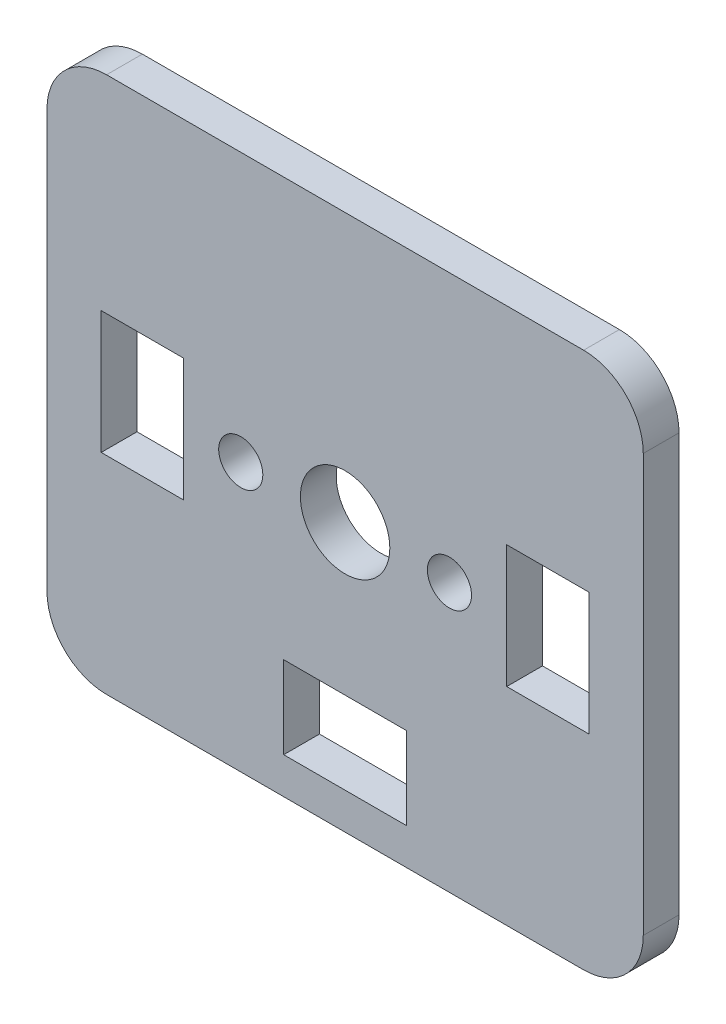
ISO-10303-21;
HEADER;
FILE_DESCRIPTION(('STEP AP214'),'2;1');
FILE_NAME('part.step','',(''),(''),'','','');
FILE_SCHEMA(('AUTOMOTIVE_DESIGN { 1 0 10303 214 1 1 1 1 }'));
ENDSEC;
DATA;
#1=APPLICATION_CONTEXT('core data for automotive mechanical design processes');
#2=APPLICATION_PROTOCOL_DEFINITION('international standard','automotive_design',2000,#1);
#3=PRODUCT_CONTEXT('',#1,'mechanical');
#4=PRODUCT('Part','Part','',(#3));
#5=PRODUCT_RELATED_PRODUCT_CATEGORY('part','',(#4));
#6=PRODUCT_DEFINITION_FORMATION('','',#4);
#7=PRODUCT_DEFINITION_CONTEXT('part definition',#1,'design');
#8=PRODUCT_DEFINITION('design','',#6,#7);
#9=PRODUCT_DEFINITION_SHAPE('','',#8);
#10=(LENGTH_UNIT() NAMED_UNIT(*) SI_UNIT(.MILLI.,.METRE.));
#11=(NAMED_UNIT(*) PLANE_ANGLE_UNIT() SI_UNIT($,.RADIAN.));
#12=(NAMED_UNIT(*) SI_UNIT($,.STERADIAN.) SOLID_ANGLE_UNIT());
#13=UNCERTAINTY_MEASURE_WITH_UNIT(LENGTH_MEASURE(1.E-05),#10,'distance_accuracy_value','');
#14=(GEOMETRIC_REPRESENTATION_CONTEXT(3) GLOBAL_UNCERTAINTY_ASSIGNED_CONTEXT((#13)) GLOBAL_UNIT_ASSIGNED_CONTEXT((#10,
#11,#12)) REPRESENTATION_CONTEXT('',''));
#15=CARTESIAN_POINT('',(0.,0.,0.));
#16=DIRECTION('',(0.,0.,1.));
#17=DIRECTION('',(1.,0.,0.));
#18=AXIS2_PLACEMENT_3D('',#15,#16,#17);
#19=CARTESIAN_POINT('',(0.,0.,-3.));
#20=DIRECTION('',(0.,0.,1.));
#21=DIRECTION('',(-1.,0.,0.));
#22=AXIS2_PLACEMENT_3D('',#19,#20,#21);
#23=PLANE('',#22);
#24=DIRECTION('',(0.,1.,0.));
#25=VECTOR('',#24,1.);
#26=CARTESIAN_POINT('',(20.45,5.15000000000001,-3.));
#27=LINE('',#26,#25);
#28=CARTESIAN_POINT('',(20.45,-5.14999999999999,-3.));
#29=VERTEX_POINT('',#28);
#30=CARTESIAN_POINT('',(20.45,5.15000000000001,-3.));
#31=VERTEX_POINT('',#30);
#32=EDGE_CURVE('E214',#29,#31,#27,.T.);
#33=ORIENTED_EDGE('',*,*,#32,.T.);
#34=DIRECTION('',(-1.,0.,0.));
#35=VECTOR('',#34,1.);
#36=CARTESIAN_POINT('',(20.45,5.15000000000001,-3.));
#37=LINE('',#36,#35);
#38=CARTESIAN_POINT('',(13.55,5.15,-3.));
#39=VERTEX_POINT('',#38);
#40=EDGE_CURVE('E217',#31,#39,#37,.T.);
#41=ORIENTED_EDGE('',*,*,#40,.T.);
#42=DIRECTION('',(0.,-1.,0.));
#43=VECTOR('',#42,1.);
#44=CARTESIAN_POINT('',(13.55,5.15,-3.));
#45=LINE('',#44,#43);
#46=CARTESIAN_POINT('',(13.55,-5.15,-3.));
#47=VERTEX_POINT('',#46);
#48=EDGE_CURVE('E221',#39,#47,#45,.T.);
#49=ORIENTED_EDGE('',*,*,#48,.T.);
#50=DIRECTION('',(1.,0.,0.));
#51=VECTOR('',#50,1.);
#52=CARTESIAN_POINT('',(20.45,-5.14999999999999,-3.));
#53=LINE('',#52,#51);
#54=EDGE_CURVE('E224',#47,#29,#53,.T.);
#55=ORIENTED_EDGE('',*,*,#54,.T.);
#56=EDGE_LOOP('',(#33,#41,#49,#55));
#57=FACE_BOUND('',#56,.T.);
#58=CARTESIAN_POINT('',(-8.75,0.,-3.));
#59=DIRECTION('',(0.,0.,1.));
#60=DIRECTION('',(1.,0.,0.));
#61=AXIS2_PLACEMENT_3D('',#58,#59,#60);
#62=CIRCLE('',#61,1.85);
#63=CARTESIAN_POINT('',(-6.9,0.,-3.));
#64=VERTEX_POINT('',#63);
#65=EDGE_CURVE('E278',#64,#64,#62,.T.);
#66=ORIENTED_EDGE('',*,*,#65,.T.);
#67=EDGE_LOOP('',(#66));
#68=FACE_BOUND('',#67,.T.);
#69=CARTESIAN_POINT('',(8.75,0.,-3.));
#70=DIRECTION('',(0.,0.,1.));
#71=DIRECTION('',(1.,0.,0.));
#72=AXIS2_PLACEMENT_3D('',#69,#70,#71);
#73=CIRCLE('',#72,1.85);
#74=CARTESIAN_POINT('',(10.6,0.,-3.));
#75=VERTEX_POINT('',#74);
#76=EDGE_CURVE('E284',#75,#75,#73,.T.);
#77=ORIENTED_EDGE('',*,*,#76,.T.);
#78=EDGE_LOOP('',(#77));
#79=FACE_BOUND('',#78,.T.);
#80=CARTESIAN_POINT('',(0.,0.,-3.));
#81=DIRECTION('',(0.,0.,1.));
#82=DIRECTION('',(1.,0.,0.));
#83=AXIS2_PLACEMENT_3D('',#80,#81,#82);
#84=CIRCLE('',#83,3.75);
#85=CARTESIAN_POINT('',(3.75000000000001,0.,-3.));
#86=VERTEX_POINT('',#85);
#87=EDGE_CURVE('E290',#86,#86,#84,.T.);
#88=ORIENTED_EDGE('',*,*,#87,.T.);
#89=EDGE_LOOP('',(#88));
#90=FACE_BOUND('',#89,.T.);
#91=DIRECTION('',(-1.,0.,0.));
#92=VECTOR('',#91,1.);
#93=CARTESIAN_POINT('',(-25.,22.5,-3.));
#94=LINE('',#93,#92);
#95=CARTESIAN_POINT('',(20.,22.5,-3.));
#96=VERTEX_POINT('',#95);
#97=CARTESIAN_POINT('',(-20.,22.5,-3.));
#98=VERTEX_POINT('',#97);
#99=EDGE_CURVE('E299',#96,#98,#94,.T.);
#100=ORIENTED_EDGE('',*,*,#99,.F.);
#101=CARTESIAN_POINT('',(20.,17.5,-3.));
#102=DIRECTION('',(0.,0.,-1.));
#103=DIRECTION('',(-1.,0.,0.));
#104=AXIS2_PLACEMENT_3D('',#101,#102,#103);
#105=CIRCLE('',#104,5.);
#106=CARTESIAN_POINT('',(25.,17.5,-3.));
#107=VERTEX_POINT('',#106);
#108=EDGE_CURVE('E337',#107,#96,#105,.F.);
#109=ORIENTED_EDGE('',*,*,#108,.F.);
#110=DIRECTION('',(0.,1.,0.));
#111=VECTOR('',#110,1.);
#112=CARTESIAN_POINT('',(25.,-22.5,-3.));
#113=LINE('',#112,#111);
#114=CARTESIAN_POINT('',(25.,-17.5,-3.));
#115=VERTEX_POINT('',#114);
#116=EDGE_CURVE('E296',#115,#107,#113,.T.);
#117=ORIENTED_EDGE('',*,*,#116,.F.);
#118=CARTESIAN_POINT('',(20.,-17.5,-3.));
#119=DIRECTION('',(0.,0.,-1.));
#120=DIRECTION('',(-1.,0.,0.));
#121=AXIS2_PLACEMENT_3D('',#118,#119,#120);
#122=CIRCLE('',#121,5.);
#123=CARTESIAN_POINT('',(20.,-22.5,-3.));
#124=VERTEX_POINT('',#123);
#125=EDGE_CURVE('E340',#124,#115,#122,.F.);
#126=ORIENTED_EDGE('',*,*,#125,.F.);
#127=DIRECTION('',(1.,0.,0.));
#128=VECTOR('',#127,1.);
#129=CARTESIAN_POINT('',(-25.,-22.5,-3.));
#130=LINE('',#129,#128);
#131=CARTESIAN_POINT('',(-20.,-22.5,-3.));
#132=VERTEX_POINT('',#131);
#133=EDGE_CURVE('E306',#132,#124,#130,.T.);
#134=ORIENTED_EDGE('',*,*,#133,.F.);
#135=CARTESIAN_POINT('',(-20.,-17.5,-3.));
#136=DIRECTION('',(0.,0.,-1.));
#137=DIRECTION('',(-1.,0.,0.));
#138=AXIS2_PLACEMENT_3D('',#135,#136,#137);
#139=CIRCLE('',#138,5.);
#140=CARTESIAN_POINT('',(-25.,-17.5,-3.));
#141=VERTEX_POINT('',#140);
#142=EDGE_CURVE('E342',#141,#132,#139,.F.);
#143=ORIENTED_EDGE('',*,*,#142,.F.);
#144=DIRECTION('',(0.,-1.,0.));
#145=VECTOR('',#144,1.);
#146=CARTESIAN_POINT('',(-25.,-22.5,-3.));
#147=LINE('',#146,#145);
#148=CARTESIAN_POINT('',(-25.,17.5,-3.));
#149=VERTEX_POINT('',#148);
#150=EDGE_CURVE('E303',#149,#141,#147,.T.);
#151=ORIENTED_EDGE('',*,*,#150,.F.);
#152=CARTESIAN_POINT('',(-20.,17.5,-3.));
#153=DIRECTION('',(0.,0.,-1.));
#154=DIRECTION('',(-1.,0.,0.));
#155=AXIS2_PLACEMENT_3D('',#152,#153,#154);
#156=CIRCLE('',#155,5.);
#157=EDGE_CURVE('E344',#98,#149,#156,.F.);
#158=ORIENTED_EDGE('',*,*,#157,.F.);
#159=EDGE_LOOP('',(#100,#109,#117,#126,#134,#143,#151,#158));
#160=FACE_BOUND('',#159,.T.);
#161=DIRECTION('',(0.,1.,0.));
#162=VECTOR('',#161,1.);
#163=CARTESIAN_POINT('',(-13.55,5.15,-3.));
#164=LINE('',#163,#162);
#165=CARTESIAN_POINT('',(-13.55,-5.15,-3.));
#166=VERTEX_POINT('',#165);
#167=CARTESIAN_POINT('',(-13.55,5.15,-3.));
#168=VERTEX_POINT('',#167);
#169=EDGE_CURVE('E246',#166,#168,#164,.T.);
#170=ORIENTED_EDGE('',*,*,#169,.T.);
#171=DIRECTION('',(-1.,0.,0.));
#172=VECTOR('',#171,1.);
#173=CARTESIAN_POINT('',(-20.45,5.15,-3.));
#174=LINE('',#173,#172);
#175=CARTESIAN_POINT('',(-20.45,5.15,-3.));
#176=VERTEX_POINT('',#175);
#177=EDGE_CURVE('E249',#168,#176,#174,.T.);
#178=ORIENTED_EDGE('',*,*,#177,.T.);
#179=DIRECTION('',(0.,-1.,0.));
#180=VECTOR('',#179,1.);
#181=CARTESIAN_POINT('',(-20.45,5.15,-3.));
#182=LINE('',#181,#180);
#183=CARTESIAN_POINT('',(-20.45,-5.15,-3.));
#184=VERTEX_POINT('',#183);
#185=EDGE_CURVE('E253',#176,#184,#182,.T.);
#186=ORIENTED_EDGE('',*,*,#185,.T.);
#187=DIRECTION('',(1.,0.,0.));
#188=VECTOR('',#187,1.);
#189=CARTESIAN_POINT('',(-20.45,-5.15,-3.));
#190=LINE('',#189,#188);
#191=EDGE_CURVE('E256',#184,#166,#190,.T.);
#192=ORIENTED_EDGE('',*,*,#191,.T.);
#193=EDGE_LOOP('',(#170,#178,#186,#192));
#194=FACE_BOUND('',#193,.T.);
#195=DIRECTION('',(0.,1.,0.));
#196=VECTOR('',#195,1.);
#197=CARTESIAN_POINT('',(5.15,-12.55,-3.));
#198=LINE('',#197,#196);
#199=CARTESIAN_POINT('',(5.15,-19.45,-3.));
#200=VERTEX_POINT('',#199);
#201=CARTESIAN_POINT('',(5.15,-12.55,-3.));
#202=VERTEX_POINT('',#201);
#203=EDGE_CURVE('E176',#200,#202,#198,.T.);
#204=ORIENTED_EDGE('',*,*,#203,.T.);
#205=DIRECTION('',(-1.,0.,0.));
#206=VECTOR('',#205,1.);
#207=CARTESIAN_POINT('',(-5.15,-12.55,-3.));
#208=LINE('',#207,#206);
#209=CARTESIAN_POINT('',(-5.15,-12.55,-3.));
#210=VERTEX_POINT('',#209);
#211=EDGE_CURVE('E186',#202,#210,#208,.T.);
#212=ORIENTED_EDGE('',*,*,#211,.T.);
#213=DIRECTION('',(0.,-1.,0.));
#214=VECTOR('',#213,1.);
#215=CARTESIAN_POINT('',(-5.15,-12.55,-3.));
#216=LINE('',#215,#214);
#217=CARTESIAN_POINT('',(-5.15,-19.45,-3.));
#218=VERTEX_POINT('',#217);
#219=EDGE_CURVE('E191',#210,#218,#216,.T.);
#220=ORIENTED_EDGE('',*,*,#219,.T.);
#221=DIRECTION('',(1.,0.,0.));
#222=VECTOR('',#221,1.);
#223=CARTESIAN_POINT('',(-5.15,-19.45,-3.));
#224=LINE('',#223,#222);
#225=EDGE_CURVE('E195',#218,#200,#224,.T.);
#226=ORIENTED_EDGE('',*,*,#225,.T.);
#227=EDGE_LOOP('',(#204,#212,#220,#226));
#228=FACE_BOUND('',#227,.T.);
#229=ADVANCED_FACE('F35',(#57,#68,#79,#90,#160,#194,#228),#23,.F.);
#230=CARTESIAN_POINT('',(0.,0.,0.));
#231=DIRECTION('',(0.,0.,1.));
#232=DIRECTION('',(-1.,0.,0.));
#233=AXIS2_PLACEMENT_3D('',#230,#231,#232);
#234=PLANE('',#233);
#235=CARTESIAN_POINT('',(8.75,0.,0.));
#236=DIRECTION('',(0.,0.,1.));
#237=DIRECTION('',(1.,0.,0.));
#238=AXIS2_PLACEMENT_3D('',#235,#236,#237);
#239=CIRCLE('',#238,1.85);
#240=CARTESIAN_POINT('',(10.6,0.,0.));
#241=VERTEX_POINT('',#240);
#242=EDGE_CURVE('E281',#241,#241,#239,.T.);
#243=ORIENTED_EDGE('',*,*,#242,.F.);
#244=EDGE_LOOP('',(#243));
#245=FACE_BOUND('',#244,.T.);
#246=DIRECTION('',(0.,-1.,0.));
#247=VECTOR('',#246,1.);
#248=CARTESIAN_POINT('',(-25.,-22.5,0.));
#249=LINE('',#248,#247);
#250=CARTESIAN_POINT('',(-25.,17.5,0.));
#251=VERTEX_POINT('',#250);
#252=CARTESIAN_POINT('',(-25.,-17.5,0.));
#253=VERTEX_POINT('',#252);
#254=EDGE_CURVE('E314',#251,#253,#249,.T.);
#255=ORIENTED_EDGE('',*,*,#254,.T.);
#256=CARTESIAN_POINT('',(-20.,-17.5,0.));
#257=DIRECTION('',(0.,0.,-1.));
#258=DIRECTION('',(-1.,0.,0.));
#259=AXIS2_PLACEMENT_3D('',#256,#257,#258);
#260=CIRCLE('',#259,5.);
#261=CARTESIAN_POINT('',(-20.,-22.5,0.));
#262=VERTEX_POINT('',#261);
#263=EDGE_CURVE('E327',#262,#253,#260,.T.);
#264=ORIENTED_EDGE('',*,*,#263,.F.);
#265=DIRECTION('',(1.,0.,0.));
#266=VECTOR('',#265,1.);
#267=CARTESIAN_POINT('',(-25.,-22.5,0.));
#268=LINE('',#267,#266);
#269=CARTESIAN_POINT('',(20.,-22.5,0.));
#270=VERTEX_POINT('',#269);
#271=EDGE_CURVE('E300',#262,#270,#268,.T.);
#272=ORIENTED_EDGE('',*,*,#271,.T.);
#273=CARTESIAN_POINT('',(20.,-17.5,0.));
#274=DIRECTION('',(0.,0.,-1.));
#275=DIRECTION('',(-1.,0.,0.));
#276=AXIS2_PLACEMENT_3D('',#273,#274,#275);
#277=CIRCLE('',#276,5.);
#278=CARTESIAN_POINT('',(25.,-17.5,0.));
#279=VERTEX_POINT('',#278);
#280=EDGE_CURVE('E325',#279,#270,#277,.T.);
#281=ORIENTED_EDGE('',*,*,#280,.F.);
#282=DIRECTION('',(0.,1.,0.));
#283=VECTOR('',#282,1.);
#284=CARTESIAN_POINT('',(25.,-22.5,0.));
#285=LINE('',#284,#283);
#286=CARTESIAN_POINT('',(25.,17.5,0.));
#287=VERTEX_POINT('',#286);
#288=EDGE_CURVE('E293',#279,#287,#285,.T.);
#289=ORIENTED_EDGE('',*,*,#288,.T.);
#290=CARTESIAN_POINT('',(20.,17.5,0.));
#291=DIRECTION('',(0.,0.,-1.));
#292=DIRECTION('',(-1.,0.,0.));
#293=AXIS2_PLACEMENT_3D('',#290,#291,#292);
#294=CIRCLE('',#293,5.);
#295=CARTESIAN_POINT('',(20.,22.5,0.));
#296=VERTEX_POINT('',#295);
#297=EDGE_CURVE('E322',#296,#287,#294,.T.);
#298=ORIENTED_EDGE('',*,*,#297,.F.);
#299=DIRECTION('',(-1.,0.,0.));
#300=VECTOR('',#299,1.);
#301=CARTESIAN_POINT('',(-25.,22.5,0.));
#302=LINE('',#301,#300);
#303=CARTESIAN_POINT('',(-20.,22.5,0.));
#304=VERTEX_POINT('',#303);
#305=EDGE_CURVE('E311',#296,#304,#302,.T.);
#306=ORIENTED_EDGE('',*,*,#305,.T.);
#307=CARTESIAN_POINT('',(-20.,17.5,0.));
#308=DIRECTION('',(0.,0.,-1.));
#309=DIRECTION('',(-1.,0.,0.));
#310=AXIS2_PLACEMENT_3D('',#307,#308,#309);
#311=CIRCLE('',#310,5.);
#312=EDGE_CURVE('E330',#251,#304,#311,.T.);
#313=ORIENTED_EDGE('',*,*,#312,.F.);
#314=EDGE_LOOP('',(#255,#264,#272,#281,#289,#298,#306,#313));
#315=FACE_BOUND('',#314,.T.);
#316=CARTESIAN_POINT('',(0.,0.,0.));
#317=DIRECTION('',(0.,0.,1.));
#318=DIRECTION('',(1.,0.,0.));
#319=AXIS2_PLACEMENT_3D('',#316,#317,#318);
#320=CIRCLE('',#319,3.75);
#321=CARTESIAN_POINT('',(3.75000000000001,0.,0.));
#322=VERTEX_POINT('',#321);
#323=EDGE_CURVE('E287',#322,#322,#320,.T.);
#324=ORIENTED_EDGE('',*,*,#323,.F.);
#325=EDGE_LOOP('',(#324));
#326=FACE_BOUND('',#325,.T.);
#327=CARTESIAN_POINT('',(-8.75,0.,0.));
#328=DIRECTION('',(0.,0.,1.));
#329=DIRECTION('',(1.,0.,0.));
#330=AXIS2_PLACEMENT_3D('',#327,#328,#329);
#331=CIRCLE('',#330,1.85);
#332=CARTESIAN_POINT('',(-6.9,0.,0.));
#333=VERTEX_POINT('',#332);
#334=EDGE_CURVE('E277',#333,#333,#331,.T.);
#335=ORIENTED_EDGE('',*,*,#334,.F.);
#336=EDGE_LOOP('',(#335));
#337=FACE_BOUND('',#336,.T.);
#338=DIRECTION('',(1.,0.,0.));
#339=VECTOR('',#338,1.);
#340=CARTESIAN_POINT('',(-20.45,-5.15,0.));
#341=LINE('',#340,#339);
#342=CARTESIAN_POINT('',(-20.45,-5.15,0.));
#343=VERTEX_POINT('',#342);
#344=CARTESIAN_POINT('',(-13.55,-5.15,0.));
#345=VERTEX_POINT('',#344);
#346=EDGE_CURVE('E250',#343,#345,#341,.T.);
#347=ORIENTED_EDGE('',*,*,#346,.F.);
#348=DIRECTION('',(0.,-1.,0.));
#349=VECTOR('',#348,1.);
#350=CARTESIAN_POINT('',(-20.45,5.15,0.));
#351=LINE('',#350,#349);
#352=CARTESIAN_POINT('',(-20.45,5.15,0.));
#353=VERTEX_POINT('',#352);
#354=EDGE_CURVE('E265',#353,#343,#351,.T.);
#355=ORIENTED_EDGE('',*,*,#354,.F.);
#356=DIRECTION('',(-1.,0.,0.));
#357=VECTOR('',#356,1.);
#358=CARTESIAN_POINT('',(-20.45,5.15,0.));
#359=LINE('',#358,#357);
#360=CARTESIAN_POINT('',(-13.55,5.15,0.));
#361=VERTEX_POINT('',#360);
#362=EDGE_CURVE('E262',#361,#353,#359,.T.);
#363=ORIENTED_EDGE('',*,*,#362,.F.);
#364=DIRECTION('',(0.,1.,0.));
#365=VECTOR('',#364,1.);
#366=CARTESIAN_POINT('',(-13.55,5.15,0.));
#367=LINE('',#366,#365);
#368=EDGE_CURVE('E245',#345,#361,#367,.T.);
#369=ORIENTED_EDGE('',*,*,#368,.F.);
#370=EDGE_LOOP('',(#347,#355,#363,#369));
#371=FACE_BOUND('',#370,.T.);
#372=DIRECTION('',(1.,0.,0.));
#373=VECTOR('',#372,1.);
#374=CARTESIAN_POINT('',(20.45,-5.14999999999999,0.));
#375=LINE('',#374,#373);
#376=CARTESIAN_POINT('',(13.55,-5.15,0.));
#377=VERTEX_POINT('',#376);
#378=CARTESIAN_POINT('',(20.45,-5.14999999999999,0.));
#379=VERTEX_POINT('',#378);
#380=EDGE_CURVE('E218',#377,#379,#375,.T.);
#381=ORIENTED_EDGE('',*,*,#380,.F.);
#382=DIRECTION('',(0.,-1.,0.));
#383=VECTOR('',#382,1.);
#384=CARTESIAN_POINT('',(13.55,5.15,0.));
#385=LINE('',#384,#383);
#386=CARTESIAN_POINT('',(13.55,5.15,0.));
#387=VERTEX_POINT('',#386);
#388=EDGE_CURVE('E233',#387,#377,#385,.T.);
#389=ORIENTED_EDGE('',*,*,#388,.F.);
#390=DIRECTION('',(-1.,0.,0.));
#391=VECTOR('',#390,1.);
#392=CARTESIAN_POINT('',(20.45,5.15000000000001,0.));
#393=LINE('',#392,#391);
#394=CARTESIAN_POINT('',(20.45,5.15000000000001,0.));
#395=VERTEX_POINT('',#394);
#396=EDGE_CURVE('E230',#395,#387,#393,.T.);
#397=ORIENTED_EDGE('',*,*,#396,.F.);
#398=DIRECTION('',(0.,1.,0.));
#399=VECTOR('',#398,1.);
#400=CARTESIAN_POINT('',(20.45,5.15000000000001,0.));
#401=LINE('',#400,#399);
#402=EDGE_CURVE('E182',#379,#395,#401,.T.);
#403=ORIENTED_EDGE('',*,*,#402,.F.);
#404=EDGE_LOOP('',(#381,#389,#397,#403));
#405=FACE_BOUND('',#404,.T.);
#406=DIRECTION('',(1.,0.,0.));
#407=VECTOR('',#406,1.);
#408=CARTESIAN_POINT('',(-5.15,-19.45,0.));
#409=LINE('',#408,#407);
#410=CARTESIAN_POINT('',(-5.15,-19.45,0.));
#411=VERTEX_POINT('',#410);
#412=CARTESIAN_POINT('',(5.15,-19.45,0.));
#413=VERTEX_POINT('',#412);
#414=EDGE_CURVE('E196',#411,#413,#409,.T.);
#415=ORIENTED_EDGE('',*,*,#414,.F.);
#416=DIRECTION('',(0.,-1.,0.));
#417=VECTOR('',#416,1.);
#418=CARTESIAN_POINT('',(-5.15,-12.55,0.));
#419=LINE('',#418,#417);
#420=CARTESIAN_POINT('',(-5.15,-12.55,0.));
#421=VERTEX_POINT('',#420);
#422=EDGE_CURVE('E199',#421,#411,#419,.T.);
#423=ORIENTED_EDGE('',*,*,#422,.F.);
#424=DIRECTION('',(-1.,0.,0.));
#425=VECTOR('',#424,1.);
#426=CARTESIAN_POINT('',(-5.15,-12.55,0.));
#427=LINE('',#426,#425);
#428=CARTESIAN_POINT('',(5.15,-12.55,0.));
#429=VERTEX_POINT('',#428);
#430=EDGE_CURVE('E206',#429,#421,#427,.T.);
#431=ORIENTED_EDGE('',*,*,#430,.F.);
#432=DIRECTION('',(0.,1.,0.));
#433=VECTOR('',#432,1.);
#434=CARTESIAN_POINT('',(5.15,-12.55,0.));
#435=LINE('',#434,#433);
#436=EDGE_CURVE('E178',#413,#429,#435,.T.);
#437=ORIENTED_EDGE('',*,*,#436,.F.);
#438=EDGE_LOOP('',(#415,#423,#431,#437));
#439=FACE_BOUND('',#438,.T.);
#440=ADVANCED_FACE('F366',(#245,#315,#326,#337,#371,#405,#439),#234,.T.);
#441=CARTESIAN_POINT('',(25.,-22.5,-3.));
#442=DIRECTION('',(-1.,0.,0.));
#443=DIRECTION('',(0.,0.,-1.));
#444=AXIS2_PLACEMENT_3D('',#441,#442,#443);
#445=PLANE('',#444);
#446=ORIENTED_EDGE('',*,*,#116,.T.);
#447=DIRECTION('',(0.,0.,1.));
#448=VECTOR('',#447,1.);
#449=CARTESIAN_POINT('',(25.,17.5,-3.));
#450=LINE('',#449,#448);
#451=EDGE_CURVE('E43',#287,#107,#450,.F.);
#452=ORIENTED_EDGE('',*,*,#451,.F.);
#453=ORIENTED_EDGE('',*,*,#288,.F.);
#454=DIRECTION('',(0.,0.,1.));
#455=VECTOR('',#454,1.);
#456=CARTESIAN_POINT('',(25.,-17.5,-3.));
#457=LINE('',#456,#455);
#458=EDGE_CURVE('E11',#115,#279,#457,.T.);
#459=ORIENTED_EDGE('',*,*,#458,.F.);
#460=EDGE_LOOP('',(#446,#452,#453,#459));
#461=FACE_BOUND('',#460,.T.);
#462=ADVANCED_FACE('F355',(#461),#445,.F.);
#463=CARTESIAN_POINT('',(-25.,22.5,-3.));
#464=DIRECTION('',(0.,-1.,0.));
#465=DIRECTION('',(0.,0.,1.));
#466=AXIS2_PLACEMENT_3D('',#463,#464,#465);
#467=PLANE('',#466);
#468=ORIENTED_EDGE('',*,*,#305,.F.);
#469=DIRECTION('',(0.,0.,1.));
#470=VECTOR('',#469,1.);
#471=CARTESIAN_POINT('',(20.,22.5,-3.));
#472=LINE('',#471,#470);
#473=EDGE_CURVE('E333',#96,#296,#472,.T.);
#474=ORIENTED_EDGE('',*,*,#473,.F.);
#475=ORIENTED_EDGE('',*,*,#99,.T.);
#476=DIRECTION('',(0.,0.,1.));
#477=VECTOR('',#476,1.);
#478=CARTESIAN_POINT('',(-20.,22.5,-3.));
#479=LINE('',#478,#477);
#480=EDGE_CURVE('E335',#304,#98,#479,.F.);
#481=ORIENTED_EDGE('',*,*,#480,.F.);
#482=EDGE_LOOP('',(#468,#474,#475,#481));
#483=FACE_BOUND('',#482,.T.);
#484=ADVANCED_FACE('F363',(#483),#467,.F.);
#485=CARTESIAN_POINT('',(-25.,-22.5,-3.));
#486=DIRECTION('',(1.,0.,0.));
#487=DIRECTION('',(0.,0.,1.));
#488=AXIS2_PLACEMENT_3D('',#485,#486,#487);
#489=PLANE('',#488);
#490=ORIENTED_EDGE('',*,*,#150,.T.);
#491=DIRECTION('',(0.,0.,1.));
#492=VECTOR('',#491,1.);
#493=CARTESIAN_POINT('',(-25.,-17.5,-3.));
#494=LINE('',#493,#492);
#495=EDGE_CURVE('E308',#253,#141,#494,.F.);
#496=ORIENTED_EDGE('',*,*,#495,.F.);
#497=ORIENTED_EDGE('',*,*,#254,.F.);
#498=DIRECTION('',(0.,0.,1.));
#499=VECTOR('',#498,1.);
#500=CARTESIAN_POINT('',(-25.,17.5,-3.));
#501=LINE('',#500,#499);
#502=EDGE_CURVE('E320',#149,#251,#501,.T.);
#503=ORIENTED_EDGE('',*,*,#502,.F.);
#504=EDGE_LOOP('',(#490,#496,#497,#503));
#505=FACE_BOUND('',#504,.T.);
#506=ADVANCED_FACE('F378',(#505),#489,.F.);
#507=CARTESIAN_POINT('',(-25.,-22.5,-3.));
#508=DIRECTION('',(0.,1.,0.));
#509=DIRECTION('',(0.,0.,-1.));
#510=AXIS2_PLACEMENT_3D('',#507,#508,#509);
#511=PLANE('',#510);
#512=ORIENTED_EDGE('',*,*,#133,.T.);
#513=DIRECTION('',(0.,0.,1.));
#514=VECTOR('',#513,1.);
#515=CARTESIAN_POINT('',(20.,-22.5,-3.));
#516=LINE('',#515,#514);
#517=EDGE_CURVE('E50',#270,#124,#516,.F.);
#518=ORIENTED_EDGE('',*,*,#517,.F.);
#519=ORIENTED_EDGE('',*,*,#271,.F.);
#520=DIRECTION('',(0.,0.,1.));
#521=VECTOR('',#520,1.);
#522=CARTESIAN_POINT('',(-20.,-22.5,-3.));
#523=LINE('',#522,#521);
#524=EDGE_CURVE('E57',#132,#262,#523,.T.);
#525=ORIENTED_EDGE('',*,*,#524,.F.);
#526=EDGE_LOOP('',(#512,#518,#519,#525));
#527=FACE_BOUND('',#526,.T.);
#528=ADVANCED_FACE('F373',(#527),#511,.F.);
#529=CARTESIAN_POINT('',(0.,0.,-3.));
#530=DIRECTION('',(0.,0.,1.));
#531=DIRECTION('',(-1.,0.,0.));
#532=AXIS2_PLACEMENT_3D('',#529,#530,#531);
#533=CYLINDRICAL_SURFACE('',#532,3.75);
#534=ORIENTED_EDGE('',*,*,#87,.F.);
#535=EDGE_LOOP('',(#534));
#536=FACE_BOUND('',#535,.T.);
#537=ORIENTED_EDGE('',*,*,#323,.T.);
#538=EDGE_LOOP('',(#537));
#539=FACE_BOUND('',#538,.T.);
#540=ADVANCED_FACE('F403',(#536,#539),#533,.F.);
#541=CARTESIAN_POINT('',(8.75,0.,-3.));
#542=DIRECTION('',(0.,0.,1.));
#543=DIRECTION('',(-1.,0.,0.));
#544=AXIS2_PLACEMENT_3D('',#541,#542,#543);
#545=CYLINDRICAL_SURFACE('',#544,1.85);
#546=ORIENTED_EDGE('',*,*,#76,.F.);
#547=EDGE_LOOP('',(#546));
#548=FACE_BOUND('',#547,.T.);
#549=ORIENTED_EDGE('',*,*,#242,.T.);
#550=EDGE_LOOP('',(#549));
#551=FACE_BOUND('',#550,.T.);
#552=ADVANCED_FACE('F434',(#548,#551),#545,.F.);
#553=CARTESIAN_POINT('',(-8.75,0.,-3.));
#554=DIRECTION('',(0.,0.,1.));
#555=DIRECTION('',(-1.,0.,0.));
#556=AXIS2_PLACEMENT_3D('',#553,#554,#555);
#557=CYLINDRICAL_SURFACE('',#556,1.85);
#558=ORIENTED_EDGE('',*,*,#65,.F.);
#559=EDGE_LOOP('',(#558));
#560=FACE_BOUND('',#559,.T.);
#561=ORIENTED_EDGE('',*,*,#334,.T.);
#562=EDGE_LOOP('',(#561));
#563=FACE_BOUND('',#562,.T.);
#564=ADVANCED_FACE('F441',(#560,#563),#557,.F.);
#565=CARTESIAN_POINT('',(-13.55,5.15,-3.));
#566=DIRECTION('',(-1.,0.,0.));
#567=DIRECTION('',(0.,0.,-1.));
#568=AXIS2_PLACEMENT_3D('',#565,#566,#567);
#569=PLANE('',#568);
#570=ORIENTED_EDGE('',*,*,#368,.T.);
#571=DIRECTION('',(0.,0.,1.));
#572=VECTOR('',#571,1.);
#573=CARTESIAN_POINT('',(-13.55,5.15,-3.));
#574=LINE('',#573,#572);
#575=EDGE_CURVE('E275',#168,#361,#574,.T.);
#576=ORIENTED_EDGE('',*,*,#575,.F.);
#577=ORIENTED_EDGE('',*,*,#169,.F.);
#578=DIRECTION('',(0.,0.,1.));
#579=VECTOR('',#578,1.);
#580=CARTESIAN_POINT('',(-13.55,-5.15,-3.));
#581=LINE('',#580,#579);
#582=EDGE_CURVE('E259',#166,#345,#581,.T.);
#583=ORIENTED_EDGE('',*,*,#582,.T.);
#584=EDGE_LOOP('',(#570,#576,#577,#583));
#585=FACE_BOUND('',#584,.T.);
#586=ADVANCED_FACE('F448',(#585),#569,.T.);
#587=CARTESIAN_POINT('',(-20.45,5.15,-3.));
#588=DIRECTION('',(0.,-1.,0.));
#589=DIRECTION('',(0.,0.,1.));
#590=AXIS2_PLACEMENT_3D('',#587,#588,#589);
#591=PLANE('',#590);
#592=ORIENTED_EDGE('',*,*,#362,.T.);
#593=DIRECTION('',(0.,0.,1.));
#594=VECTOR('',#593,1.);
#595=CARTESIAN_POINT('',(-20.45,5.15,-3.));
#596=LINE('',#595,#594);
#597=EDGE_CURVE('E273',#176,#353,#596,.T.);
#598=ORIENTED_EDGE('',*,*,#597,.F.);
#599=ORIENTED_EDGE('',*,*,#177,.F.);
#600=ORIENTED_EDGE('',*,*,#575,.T.);
#601=EDGE_LOOP('',(#592,#598,#599,#600));
#602=FACE_BOUND('',#601,.T.);
#603=ADVANCED_FACE('F456',(#602),#591,.T.);
#604=CARTESIAN_POINT('',(-20.45,5.15,-3.));
#605=DIRECTION('',(1.,0.,0.));
#606=DIRECTION('',(0.,0.,1.));
#607=AXIS2_PLACEMENT_3D('',#604,#605,#606);
#608=PLANE('',#607);
#609=ORIENTED_EDGE('',*,*,#354,.T.);
#610=DIRECTION('',(0.,0.,1.));
#611=VECTOR('',#610,1.);
#612=CARTESIAN_POINT('',(-20.45,-5.15,-3.));
#613=LINE('',#612,#611);
#614=EDGE_CURVE('E271',#184,#343,#613,.T.);
#615=ORIENTED_EDGE('',*,*,#614,.F.);
#616=ORIENTED_EDGE('',*,*,#185,.F.);
#617=ORIENTED_EDGE('',*,*,#597,.T.);
#618=EDGE_LOOP('',(#609,#615,#616,#617));
#619=FACE_BOUND('',#618,.T.);
#620=ADVANCED_FACE('F464',(#619),#608,.T.);
#621=CARTESIAN_POINT('',(-20.45,-5.15,-3.));
#622=DIRECTION('',(0.,1.,0.));
#623=DIRECTION('',(0.,0.,-1.));
#624=AXIS2_PLACEMENT_3D('',#621,#622,#623);
#625=PLANE('',#624);
#626=ORIENTED_EDGE('',*,*,#346,.T.);
#627=ORIENTED_EDGE('',*,*,#582,.F.);
#628=ORIENTED_EDGE('',*,*,#191,.F.);
#629=ORIENTED_EDGE('',*,*,#614,.T.);
#630=EDGE_LOOP('',(#626,#627,#628,#629));
#631=FACE_BOUND('',#630,.T.);
#632=ADVANCED_FACE('F472',(#631),#625,.T.);
#633=CARTESIAN_POINT('',(20.45,5.15000000000001,-3.));
#634=DIRECTION('',(-1.,0.,0.));
#635=DIRECTION('',(0.,-1.,0.));
#636=AXIS2_PLACEMENT_3D('',#633,#634,#635);
#637=PLANE('',#636);
#638=ORIENTED_EDGE('',*,*,#402,.T.);
#639=DIRECTION('',(0.,0.,1.));
#640=VECTOR('',#639,1.);
#641=CARTESIAN_POINT('',(20.45,5.15000000000001,-3.));
#642=LINE('',#641,#640);
#643=EDGE_CURVE('E243',#31,#395,#642,.T.);
#644=ORIENTED_EDGE('',*,*,#643,.F.);
#645=ORIENTED_EDGE('',*,*,#32,.F.);
#646=DIRECTION('',(0.,0.,1.));
#647=VECTOR('',#646,1.);
#648=CARTESIAN_POINT('',(20.45,-5.14999999999999,-3.));
#649=LINE('',#648,#647);
#650=EDGE_CURVE('E227',#29,#379,#649,.T.);
#651=ORIENTED_EDGE('',*,*,#650,.T.);
#652=EDGE_LOOP('',(#638,#644,#645,#651));
#653=FACE_BOUND('',#652,.T.);
#654=ADVANCED_FACE('F480',(#653),#637,.T.);
#655=CARTESIAN_POINT('',(20.45,5.15000000000001,-3.));
#656=DIRECTION('',(0.,-1.,0.));
#657=DIRECTION('',(1.,0.,0.));
#658=AXIS2_PLACEMENT_3D('',#655,#656,#657);
#659=PLANE('',#658);
#660=ORIENTED_EDGE('',*,*,#396,.T.);
#661=DIRECTION('',(0.,0.,1.));
#662=VECTOR('',#661,1.);
#663=CARTESIAN_POINT('',(13.55,5.15,-3.));
#664=LINE('',#663,#662);
#665=EDGE_CURVE('E241',#39,#387,#664,.T.);
#666=ORIENTED_EDGE('',*,*,#665,.F.);
#667=ORIENTED_EDGE('',*,*,#40,.F.);
#668=ORIENTED_EDGE('',*,*,#643,.T.);
#669=EDGE_LOOP('',(#660,#666,#667,#668));
#670=FACE_BOUND('',#669,.T.);
#671=ADVANCED_FACE('F488',(#670),#659,.T.);
#672=CARTESIAN_POINT('',(13.55,5.15,-3.));
#673=DIRECTION('',(1.,0.,0.));
#674=DIRECTION('',(0.,1.,0.));
#675=AXIS2_PLACEMENT_3D('',#672,#673,#674);
#676=PLANE('',#675);
#677=ORIENTED_EDGE('',*,*,#388,.T.);
#678=DIRECTION('',(0.,0.,1.));
#679=VECTOR('',#678,1.);
#680=CARTESIAN_POINT('',(13.55,-5.15,-3.));
#681=LINE('',#680,#679);
#682=EDGE_CURVE('E239',#47,#377,#681,.T.);
#683=ORIENTED_EDGE('',*,*,#682,.F.);
#684=ORIENTED_EDGE('',*,*,#48,.F.);
#685=ORIENTED_EDGE('',*,*,#665,.T.);
#686=EDGE_LOOP('',(#677,#683,#684,#685));
#687=FACE_BOUND('',#686,.T.);
#688=ADVANCED_FACE('F496',(#687),#676,.T.);
#689=CARTESIAN_POINT('',(20.45,-5.14999999999999,-3.));
#690=DIRECTION('',(0.,1.,0.));
#691=DIRECTION('',(-1.,0.,0.));
#692=AXIS2_PLACEMENT_3D('',#689,#690,#691);
#693=PLANE('',#692);
#694=ORIENTED_EDGE('',*,*,#380,.T.);
#695=ORIENTED_EDGE('',*,*,#650,.F.);
#696=ORIENTED_EDGE('',*,*,#54,.F.);
#697=ORIENTED_EDGE('',*,*,#682,.T.);
#698=EDGE_LOOP('',(#694,#695,#696,#697));
#699=FACE_BOUND('',#698,.T.);
#700=ADVANCED_FACE('F504',(#699),#693,.T.);
#701=CARTESIAN_POINT('',(5.15,-12.55,-3.));
#702=DIRECTION('',(-1.,0.,0.));
#703=DIRECTION('',(0.,-1.,0.));
#704=AXIS2_PLACEMENT_3D('',#701,#702,#703);
#705=PLANE('',#704);
#706=ORIENTED_EDGE('',*,*,#436,.T.);
#707=DIRECTION('',(0.,0.,1.));
#708=VECTOR('',#707,1.);
#709=CARTESIAN_POINT('',(5.15,-12.55,-3.));
#710=LINE('',#709,#708);
#711=EDGE_CURVE('E172',#202,#429,#710,.T.);
#712=ORIENTED_EDGE('',*,*,#711,.F.);
#713=ORIENTED_EDGE('',*,*,#203,.F.);
#714=DIRECTION('',(0.,0.,1.));
#715=VECTOR('',#714,1.);
#716=CARTESIAN_POINT('',(5.15,-19.45,-3.));
#717=LINE('',#716,#715);
#718=EDGE_CURVE('E204',#200,#413,#717,.T.);
#719=ORIENTED_EDGE('',*,*,#718,.T.);
#720=EDGE_LOOP('',(#706,#712,#713,#719));
#721=FACE_BOUND('',#720,.T.);
#722=ADVANCED_FACE('F174',(#721),#705,.T.);
#723=CARTESIAN_POINT('',(-5.15,-12.55,-3.));
#724=DIRECTION('',(0.,-1.,0.));
#725=DIRECTION('',(0.,0.,1.));
#726=AXIS2_PLACEMENT_3D('',#723,#724,#725);
#727=PLANE('',#726);
#728=ORIENTED_EDGE('',*,*,#430,.T.);
#729=DIRECTION('',(0.,0.,1.));
#730=VECTOR('',#729,1.);
#731=CARTESIAN_POINT('',(-5.15,-12.55,-3.));
#732=LINE('',#731,#730);
#733=EDGE_CURVE('E183',#210,#421,#732,.T.);
#734=ORIENTED_EDGE('',*,*,#733,.F.);
#735=ORIENTED_EDGE('',*,*,#211,.F.);
#736=ORIENTED_EDGE('',*,*,#711,.T.);
#737=EDGE_LOOP('',(#728,#734,#735,#736));
#738=FACE_BOUND('',#737,.T.);
#739=ADVANCED_FACE('F187',(#738),#727,.T.);
#740=CARTESIAN_POINT('',(-5.15,-12.55,-3.));
#741=DIRECTION('',(1.,0.,0.));
#742=DIRECTION('',(0.,1.,0.));
#743=AXIS2_PLACEMENT_3D('',#740,#741,#742);
#744=PLANE('',#743);
#745=ORIENTED_EDGE('',*,*,#422,.T.);
#746=DIRECTION('',(0.,0.,1.));
#747=VECTOR('',#746,1.);
#748=CARTESIAN_POINT('',(-5.15,-19.45,-3.));
#749=LINE('',#748,#747);
#750=EDGE_CURVE('E211',#218,#411,#749,.T.);
#751=ORIENTED_EDGE('',*,*,#750,.F.);
#752=ORIENTED_EDGE('',*,*,#219,.F.);
#753=ORIENTED_EDGE('',*,*,#733,.T.);
#754=EDGE_LOOP('',(#745,#751,#752,#753));
#755=FACE_BOUND('',#754,.T.);
#756=ADVANCED_FACE('F389',(#755),#744,.T.);
#757=CARTESIAN_POINT('',(-5.15,-19.45,-3.));
#758=DIRECTION('',(0.,1.,0.));
#759=DIRECTION('',(0.,0.,-1.));
#760=AXIS2_PLACEMENT_3D('',#757,#758,#759);
#761=PLANE('',#760);
#762=ORIENTED_EDGE('',*,*,#414,.T.);
#763=ORIENTED_EDGE('',*,*,#718,.F.);
#764=ORIENTED_EDGE('',*,*,#225,.F.);
#765=ORIENTED_EDGE('',*,*,#750,.T.);
#766=EDGE_LOOP('',(#762,#763,#764,#765));
#767=FACE_BOUND('',#766,.T.);
#768=ADVANCED_FACE('F382',(#767),#761,.T.);
#769=CARTESIAN_POINT('',(-20.,17.5,-3.));
#770=DIRECTION('',(0.,0.,1.));
#771=DIRECTION('',(-1.,0.,0.));
#772=AXIS2_PLACEMENT_3D('',#769,#770,#771);
#773=CYLINDRICAL_SURFACE('',#772,5.);
#774=ORIENTED_EDGE('',*,*,#157,.T.);
#775=ORIENTED_EDGE('',*,*,#502,.T.);
#776=ORIENTED_EDGE('',*,*,#312,.T.);
#777=ORIENTED_EDGE('',*,*,#480,.T.);
#778=EDGE_LOOP('',(#774,#775,#776,#777));
#779=FACE_BOUND('',#778,.T.);
#780=ADVANCED_FACE('F380',(#779),#773,.T.);
#781=CARTESIAN_POINT('',(-20.,-17.5,-3.));
#782=DIRECTION('',(0.,0.,1.));
#783=DIRECTION('',(-1.,0.,0.));
#784=AXIS2_PLACEMENT_3D('',#781,#782,#783);
#785=CYLINDRICAL_SURFACE('',#784,5.);
#786=ORIENTED_EDGE('',*,*,#142,.T.);
#787=ORIENTED_EDGE('',*,*,#524,.T.);
#788=ORIENTED_EDGE('',*,*,#263,.T.);
#789=ORIENTED_EDGE('',*,*,#495,.T.);
#790=EDGE_LOOP('',(#786,#787,#788,#789));
#791=FACE_BOUND('',#790,.T.);
#792=ADVANCED_FACE('F376',(#791),#785,.T.);
#793=CARTESIAN_POINT('',(20.,-17.5,-3.));
#794=DIRECTION('',(0.,0.,1.));
#795=DIRECTION('',(-1.,0.,0.));
#796=AXIS2_PLACEMENT_3D('',#793,#794,#795);
#797=CYLINDRICAL_SURFACE('',#796,5.);
#798=ORIENTED_EDGE('',*,*,#125,.T.);
#799=ORIENTED_EDGE('',*,*,#458,.T.);
#800=ORIENTED_EDGE('',*,*,#280,.T.);
#801=ORIENTED_EDGE('',*,*,#517,.T.);
#802=EDGE_LOOP('',(#798,#799,#800,#801));
#803=FACE_BOUND('',#802,.T.);
#804=ADVANCED_FACE('F370',(#803),#797,.T.);
#805=CARTESIAN_POINT('',(20.,17.5,-3.));
#806=DIRECTION('',(0.,0.,1.));
#807=DIRECTION('',(-1.,0.,0.));
#808=AXIS2_PLACEMENT_3D('',#805,#806,#807);
#809=CYLINDRICAL_SURFACE('',#808,5.);
#810=ORIENTED_EDGE('',*,*,#108,.T.);
#811=ORIENTED_EDGE('',*,*,#473,.T.);
#812=ORIENTED_EDGE('',*,*,#297,.T.);
#813=ORIENTED_EDGE('',*,*,#451,.T.);
#814=EDGE_LOOP('',(#810,#811,#812,#813));
#815=FACE_BOUND('',#814,.T.);
#816=ADVANCED_FACE('F37',(#815),#809,.T.);
#817=CLOSED_SHELL('',(#229,#440,#462,#484,#506,#528,#540,#552,#564,#586,#603,#620,#632,#654,
#671,#688,#700,#722,#739,#756,#768,#780,#792,#804,#816));
#818=MANIFOLD_SOLID_BREP('B2',#817);
#819=ADVANCED_BREP_SHAPE_REPRESENTATION('',(#18,#818),#14);
#820=SHAPE_DEFINITION_REPRESENTATION(#9,#819);
ENDSEC;
END-ISO-10303-21;
